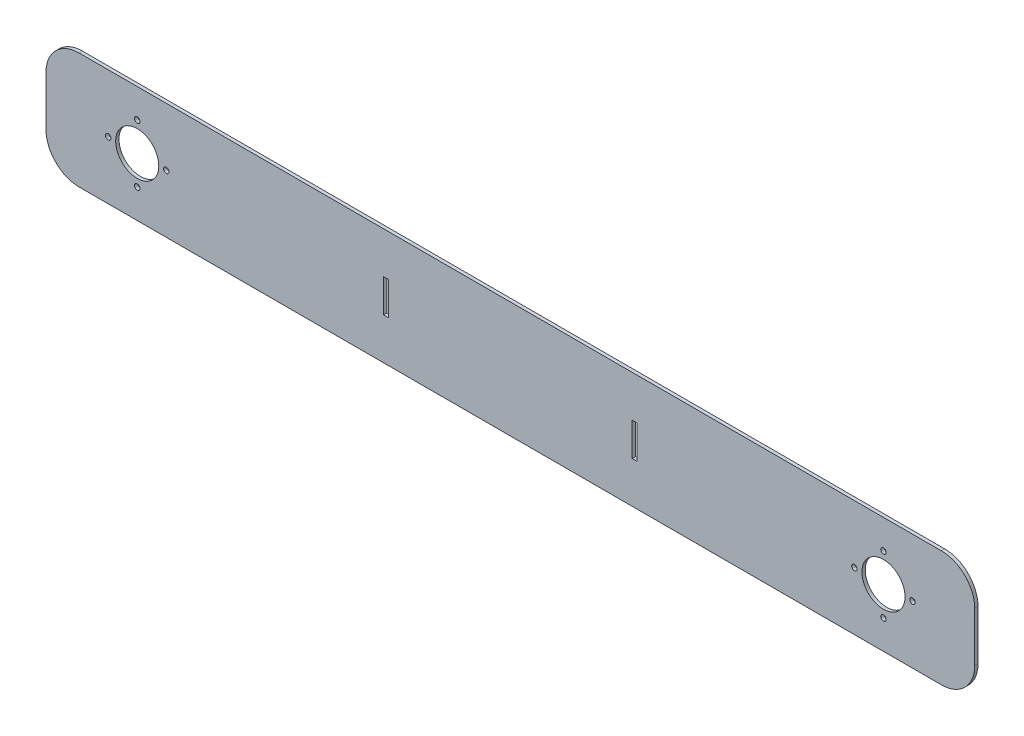
ISO-10303-21;
HEADER;
FILE_DESCRIPTION(('STEP AP214'),'2;1');
FILE_NAME('part.step','',(''),(''),'','','');
FILE_SCHEMA(('AUTOMOTIVE_DESIGN { 1 0 10303 214 1 1 1 1 }'));
ENDSEC;
DATA;
#1=APPLICATION_CONTEXT('core data for automotive mechanical design processes');
#2=APPLICATION_PROTOCOL_DEFINITION('international standard','automotive_design',2000,#1);
#3=PRODUCT_CONTEXT('',#1,'mechanical');
#4=PRODUCT('Part','Part','',(#3));
#5=PRODUCT_RELATED_PRODUCT_CATEGORY('part','',(#4));
#6=PRODUCT_DEFINITION_FORMATION('','',#4);
#7=PRODUCT_DEFINITION_CONTEXT('part definition',#1,'design');
#8=PRODUCT_DEFINITION('design','',#6,#7);
#9=PRODUCT_DEFINITION_SHAPE('','',#8);
#10=(LENGTH_UNIT() NAMED_UNIT(*) SI_UNIT(.MILLI.,.METRE.));
#11=(NAMED_UNIT(*) PLANE_ANGLE_UNIT() SI_UNIT($,.RADIAN.));
#12=(NAMED_UNIT(*) SI_UNIT($,.STERADIAN.) SOLID_ANGLE_UNIT());
#13=UNCERTAINTY_MEASURE_WITH_UNIT(LENGTH_MEASURE(1.E-05),#10,'distance_accuracy_value','');
#14=(GEOMETRIC_REPRESENTATION_CONTEXT(3) GLOBAL_UNCERTAINTY_ASSIGNED_CONTEXT((#13)) GLOBAL_UNIT_ASSIGNED_CONTEXT((#10,
#11,#12)) REPRESENTATION_CONTEXT('',''));
#15=CARTESIAN_POINT('',(0.,0.,0.));
#16=DIRECTION('',(0.,0.,1.));
#17=DIRECTION('',(1.,0.,0.));
#18=AXIS2_PLACEMENT_3D('',#15,#16,#17);
#19=CARTESIAN_POINT('',(-280.,-30.,2.));
#20=DIRECTION('',(0.,0.,1.));
#21=DIRECTION('',(1.,0.,0.));
#22=AXIS2_PLACEMENT_3D('',#19,#20,#21);
#23=PLANE('',#22);
#24=DIRECTION('',(0.,1.,0.));
#25=VECTOR('',#24,1.);
#26=CARTESIAN_POINT('',(76.4999999999999,10.,2.));
#27=LINE('',#26,#25);
#28=CARTESIAN_POINT('',(76.4999999999999,-10.,2.));
#29=VERTEX_POINT('',#28);
#30=CARTESIAN_POINT('',(76.5,10.,2.));
#31=VERTEX_POINT('',#30);
#32=EDGE_CURVE('E73',#29,#31,#27,.T.);
#33=ORIENTED_EDGE('',*,*,#32,.F.);
#34=DIRECTION('',(1.,0.,0.));
#35=VECTOR('',#34,1.);
#36=CARTESIAN_POINT('',(73.4999999999999,-10.,2.));
#37=LINE('',#36,#35);
#38=CARTESIAN_POINT('',(73.4999999999999,-10.,2.));
#39=VERTEX_POINT('',#38);
#40=EDGE_CURVE('E189',#39,#29,#37,.T.);
#41=ORIENTED_EDGE('',*,*,#40,.F.);
#42=DIRECTION('',(0.,-1.,0.));
#43=VECTOR('',#42,1.);
#44=CARTESIAN_POINT('',(73.4999999999999,10.,2.));
#45=LINE('',#44,#43);
#46=CARTESIAN_POINT('',(73.4999999999999,10.,2.));
#47=VERTEX_POINT('',#46);
#48=EDGE_CURVE('E174',#47,#39,#45,.T.);
#49=ORIENTED_EDGE('',*,*,#48,.F.);
#50=DIRECTION('',(-1.,0.,0.));
#51=VECTOR('',#50,1.);
#52=CARTESIAN_POINT('',(73.4999999999999,10.,2.));
#53=LINE('',#52,#51);
#54=EDGE_CURVE('E183',#31,#47,#53,.T.);
#55=ORIENTED_EDGE('',*,*,#54,.F.);
#56=EDGE_LOOP('',(#33,#41,#49,#55));
#57=FACE_BOUND('',#56,.T.);
#58=DIRECTION('',(0.,1.,0.));
#59=VECTOR('',#58,1.);
#60=CARTESIAN_POINT('',(-73.5000000000001,10.,2.));
#61=LINE('',#60,#59);
#62=CARTESIAN_POINT('',(-73.5000000000001,-10.,2.));
#63=VERTEX_POINT('',#62);
#64=CARTESIAN_POINT('',(-73.5000000000001,10.,2.));
#65=VERTEX_POINT('',#64);
#66=EDGE_CURVE('E196',#63,#65,#61,.T.);
#67=ORIENTED_EDGE('',*,*,#66,.F.);
#68=DIRECTION('',(1.,0.,0.));
#69=VECTOR('',#68,1.);
#70=CARTESIAN_POINT('',(-76.5000000000001,-10.,2.));
#71=LINE('',#70,#69);
#72=CARTESIAN_POINT('',(-76.5000000000001,-10.,2.));
#73=VERTEX_POINT('',#72);
#74=EDGE_CURVE('E206',#73,#63,#71,.T.);
#75=ORIENTED_EDGE('',*,*,#74,.F.);
#76=DIRECTION('',(0.,-1.,0.));
#77=VECTOR('',#76,1.);
#78=CARTESIAN_POINT('',(-76.5000000000001,10.,2.));
#79=LINE('',#78,#77);
#80=CARTESIAN_POINT('',(-76.5000000000001,10.,2.));
#81=VERTEX_POINT('',#80);
#82=EDGE_CURVE('E203',#81,#73,#79,.T.);
#83=ORIENTED_EDGE('',*,*,#82,.F.);
#84=DIRECTION('',(-1.,0.,0.));
#85=VECTOR('',#84,1.);
#86=CARTESIAN_POINT('',(-76.5000000000001,10.,2.));
#87=LINE('',#86,#85);
#88=EDGE_CURVE('E200',#65,#81,#87,.T.);
#89=ORIENTED_EDGE('',*,*,#88,.F.);
#90=EDGE_LOOP('',(#67,#75,#83,#89));
#91=FACE_BOUND('',#90,.T.);
#92=DIRECTION('',(1.,0.,0.));
#93=VECTOR('',#92,1.);
#94=CARTESIAN_POINT('',(-386.946895635758,-35.,2.));
#95=LINE('',#94,#93);
#96=CARTESIAN_POINT('',(-260.,-35.,2.));
#97=VERTEX_POINT('',#96);
#98=CARTESIAN_POINT('',(260.,-35.,2.));
#99=VERTEX_POINT('',#98);
#100=EDGE_CURVE('E230',#97,#99,#95,.T.);
#101=ORIENTED_EDGE('',*,*,#100,.T.);
#102=CARTESIAN_POINT('',(260.,-15.,2.));
#103=DIRECTION('',(0.,0.,1.));
#104=DIRECTION('',(1.,0.,0.));
#105=AXIS2_PLACEMENT_3D('',#102,#103,#104);
#106=CIRCLE('',#105,20.);
#107=CARTESIAN_POINT('',(280.,-15.,2.));
#108=VERTEX_POINT('',#107);
#109=EDGE_CURVE('E325',#99,#108,#106,.T.);
#110=ORIENTED_EDGE('',*,*,#109,.T.);
#111=DIRECTION('',(0.,-1.,0.));
#112=VECTOR('',#111,1.);
#113=CARTESIAN_POINT('',(280.,58.1576556097638,2.));
#114=LINE('',#113,#112);
#115=CARTESIAN_POINT('',(280.,15.,2.));
#116=VERTEX_POINT('',#115);
#117=EDGE_CURVE('E212',#116,#108,#114,.T.);
#118=ORIENTED_EDGE('',*,*,#117,.F.);
#119=CARTESIAN_POINT('',(260.,15.,2.));
#120=DIRECTION('',(0.,0.,1.));
#121=DIRECTION('',(1.,0.,0.));
#122=AXIS2_PLACEMENT_3D('',#119,#120,#121);
#123=CIRCLE('',#122,20.);
#124=CARTESIAN_POINT('',(260.,35.,2.));
#125=VERTEX_POINT('',#124);
#126=EDGE_CURVE('E323',#116,#125,#123,.T.);
#127=ORIENTED_EDGE('',*,*,#126,.T.);
#128=DIRECTION('',(1.,0.,0.));
#129=VECTOR('',#128,1.);
#130=CARTESIAN_POINT('',(-386.946895635758,35.,2.));
#131=LINE('',#130,#129);
#132=CARTESIAN_POINT('',(-260.,35.,2.));
#133=VERTEX_POINT('',#132);
#134=EDGE_CURVE('E233',#133,#125,#131,.T.);
#135=ORIENTED_EDGE('',*,*,#134,.F.);
#136=CARTESIAN_POINT('',(-260.,15.,2.));
#137=DIRECTION('',(0.,0.,1.));
#138=DIRECTION('',(1.,0.,0.));
#139=AXIS2_PLACEMENT_3D('',#136,#137,#138);
#140=CIRCLE('',#139,20.);
#141=CARTESIAN_POINT('',(-280.,15.,2.));
#142=VERTEX_POINT('',#141);
#143=EDGE_CURVE('E319',#133,#142,#140,.T.);
#144=ORIENTED_EDGE('',*,*,#143,.T.);
#145=DIRECTION('',(0.,1.,0.));
#146=VECTOR('',#145,1.);
#147=CARTESIAN_POINT('',(-280.,62.6260788166557,2.));
#148=LINE('',#147,#146);
#149=CARTESIAN_POINT('',(-280.,-15.,2.));
#150=VERTEX_POINT('',#149);
#151=EDGE_CURVE('E224',#150,#142,#148,.T.);
#152=ORIENTED_EDGE('',*,*,#151,.F.);
#153=CARTESIAN_POINT('',(-260.,-15.,2.));
#154=DIRECTION('',(0.,0.,1.));
#155=DIRECTION('',(1.,0.,0.));
#156=AXIS2_PLACEMENT_3D('',#153,#154,#155);
#157=CIRCLE('',#156,20.);
#158=EDGE_CURVE('E321',#150,#97,#157,.T.);
#159=ORIENTED_EDGE('',*,*,#158,.T.);
#160=EDGE_LOOP('',(#101,#110,#118,#127,#135,#144,#152,#159));
#161=FACE_BOUND('',#160,.T.);
#162=CARTESIAN_POINT('',(-225.,-17.5,2.));
#163=DIRECTION('',(0.,0.,1.));
#164=DIRECTION('',(1.,0.,0.));
#165=AXIS2_PLACEMENT_3D('',#162,#163,#164);
#166=CIRCLE('',#165,1.65000000000002);
#167=CARTESIAN_POINT('',(-223.35,-17.5,2.));
#168=VERTEX_POINT('',#167);
#169=EDGE_CURVE('E255',#168,#168,#166,.T.);
#170=ORIENTED_EDGE('',*,*,#169,.F.);
#171=EDGE_LOOP('',(#170));
#172=FACE_BOUND('',#171,.T.);
#173=CARTESIAN_POINT('',(242.5,0.,2.));
#174=DIRECTION('',(0.,0.,1.));
#175=DIRECTION('',(1.,0.,0.));
#176=AXIS2_PLACEMENT_3D('',#173,#174,#175);
#177=CIRCLE('',#176,1.65000000000002);
#178=CARTESIAN_POINT('',(244.15,0.,2.));
#179=VERTEX_POINT('',#178);
#180=EDGE_CURVE('E244',#179,#179,#177,.T.);
#181=ORIENTED_EDGE('',*,*,#180,.F.);
#182=EDGE_LOOP('',(#181));
#183=FACE_BOUND('',#182,.T.);
#184=CARTESIAN_POINT('',(225.,17.5,2.));
#185=DIRECTION('',(0.,0.,1.));
#186=DIRECTION('',(1.,0.,0.));
#187=AXIS2_PLACEMENT_3D('',#184,#185,#186);
#188=CIRCLE('',#187,1.65000000000002);
#189=CARTESIAN_POINT('',(226.65,17.5,2.));
#190=VERTEX_POINT('',#189);
#191=EDGE_CURVE('E237',#190,#190,#188,.T.);
#192=ORIENTED_EDGE('',*,*,#191,.F.);
#193=EDGE_LOOP('',(#192));
#194=FACE_BOUND('',#193,.T.);
#195=CARTESIAN_POINT('',(207.5,0.,2.));
#196=DIRECTION('',(0.,0.,1.));
#197=DIRECTION('',(1.,0.,0.));
#198=AXIS2_PLACEMENT_3D('',#195,#196,#197);
#199=CIRCLE('',#198,1.65000000000002);
#200=CARTESIAN_POINT('',(209.15,0.,2.));
#201=VERTEX_POINT('',#200);
#202=EDGE_CURVE('E245',#201,#201,#199,.T.);
#203=ORIENTED_EDGE('',*,*,#202,.F.);
#204=EDGE_LOOP('',(#203));
#205=FACE_BOUND('',#204,.T.);
#206=CARTESIAN_POINT('',(225.,-17.5,2.));
#207=DIRECTION('',(0.,0.,1.));
#208=DIRECTION('',(1.,0.,0.));
#209=AXIS2_PLACEMENT_3D('',#206,#207,#208);
#210=CIRCLE('',#209,1.65000000000002);
#211=CARTESIAN_POINT('',(226.65,-17.5,2.));
#212=VERTEX_POINT('',#211);
#213=EDGE_CURVE('E236',#212,#212,#210,.T.);
#214=ORIENTED_EDGE('',*,*,#213,.F.);
#215=EDGE_LOOP('',(#214));
#216=FACE_BOUND('',#215,.T.);
#217=CARTESIAN_POINT('',(225.,0.,2.));
#218=DIRECTION('',(0.,0.,1.));
#219=DIRECTION('',(1.,0.,0.));
#220=AXIS2_PLACEMENT_3D('',#217,#218,#219);
#221=CIRCLE('',#220,13.);
#222=CARTESIAN_POINT('',(238.,0.,2.));
#223=VERTEX_POINT('',#222);
#224=EDGE_CURVE('E279',#223,#223,#221,.T.);
#225=ORIENTED_EDGE('',*,*,#224,.F.);
#226=EDGE_LOOP('',(#225));
#227=FACE_BOUND('',#226,.T.);
#228=CARTESIAN_POINT('',(-242.5,0.,2.));
#229=DIRECTION('',(0.,0.,1.));
#230=DIRECTION('',(1.,0.,0.));
#231=AXIS2_PLACEMENT_3D('',#228,#229,#230);
#232=CIRCLE('',#231,1.65000000000002);
#233=CARTESIAN_POINT('',(-240.85,0.,2.));
#234=VERTEX_POINT('',#233);
#235=EDGE_CURVE('E274',#234,#234,#232,.T.);
#236=ORIENTED_EDGE('',*,*,#235,.F.);
#237=EDGE_LOOP('',(#236));
#238=FACE_BOUND('',#237,.T.);
#239=CARTESIAN_POINT('',(-207.5,0.,2.));
#240=DIRECTION('',(0.,0.,1.));
#241=DIRECTION('',(1.,0.,0.));
#242=AXIS2_PLACEMENT_3D('',#239,#240,#241);
#243=CIRCLE('',#242,1.65000000000002);
#244=CARTESIAN_POINT('',(-205.85,0.,2.));
#245=VERTEX_POINT('',#244);
#246=EDGE_CURVE('E267',#245,#245,#243,.T.);
#247=ORIENTED_EDGE('',*,*,#246,.F.);
#248=EDGE_LOOP('',(#247));
#249=FACE_BOUND('',#248,.T.);
#250=CARTESIAN_POINT('',(-225.,17.5,2.));
#251=DIRECTION('',(0.,0.,1.));
#252=DIRECTION('',(1.,0.,0.));
#253=AXIS2_PLACEMENT_3D('',#250,#251,#252);
#254=CIRCLE('',#253,1.65000000000002);
#255=CARTESIAN_POINT('',(-223.35,17.5,2.));
#256=VERTEX_POINT('',#255);
#257=EDGE_CURVE('E262',#256,#256,#254,.T.);
#258=ORIENTED_EDGE('',*,*,#257,.F.);
#259=EDGE_LOOP('',(#258));
#260=FACE_BOUND('',#259,.T.);
#261=CARTESIAN_POINT('',(-225.,0.,2.));
#262=DIRECTION('',(0.,0.,1.));
#263=DIRECTION('',(1.,0.,0.));
#264=AXIS2_PLACEMENT_3D('',#261,#262,#263);
#265=CIRCLE('',#264,13.);
#266=CARTESIAN_POINT('',(-212.,0.,2.));
#267=VERTEX_POINT('',#266);
#268=EDGE_CURVE('E286',#267,#267,#265,.T.);
#269=ORIENTED_EDGE('',*,*,#268,.F.);
#270=EDGE_LOOP('',(#269));
#271=FACE_BOUND('',#270,.T.);
#272=ADVANCED_FACE('F58',(#57,#91,#161,#172,#183,#194,#205,#216,#227,#238,#249,#260,#271),#23,.T.);
#273=CARTESIAN_POINT('',(-280.,-30.,0.));
#274=DIRECTION('',(0.,0.,1.));
#275=DIRECTION('',(1.,0.,0.));
#276=AXIS2_PLACEMENT_3D('',#273,#274,#275);
#277=PLANE('',#276);
#278=DIRECTION('',(1.,0.,0.));
#279=VECTOR('',#278,1.);
#280=CARTESIAN_POINT('',(-280.,-10.,0.));
#281=LINE('',#280,#279);
#282=CARTESIAN_POINT('',(73.4999999999999,-10.,0.));
#283=VERTEX_POINT('',#282);
#284=CARTESIAN_POINT('',(76.4999999999999,-10.,0.));
#285=VERTEX_POINT('',#284);
#286=EDGE_CURVE('E66',#283,#285,#281,.T.);
#287=ORIENTED_EDGE('',*,*,#286,.T.);
#288=DIRECTION('',(0.,1.,0.));
#289=VECTOR('',#288,1.);
#290=CARTESIAN_POINT('',(76.5,-30.,0.));
#291=LINE('',#290,#289);
#292=CARTESIAN_POINT('',(76.4999999999999,10.,0.));
#293=VERTEX_POINT('',#292);
#294=EDGE_CURVE('E13',#285,#293,#291,.T.);
#295=ORIENTED_EDGE('',*,*,#294,.T.);
#296=DIRECTION('',(-1.,0.,0.));
#297=VECTOR('',#296,1.);
#298=CARTESIAN_POINT('',(-280.,10.,0.));
#299=LINE('',#298,#297);
#300=CARTESIAN_POINT('',(73.4999999999999,10.,0.));
#301=VERTEX_POINT('',#300);
#302=EDGE_CURVE('E350',#293,#301,#299,.T.);
#303=ORIENTED_EDGE('',*,*,#302,.T.);
#304=DIRECTION('',(0.,-1.,0.));
#305=VECTOR('',#304,1.);
#306=CARTESIAN_POINT('',(73.5,-30.,0.));
#307=LINE('',#306,#305);
#308=EDGE_CURVE('E177',#301,#283,#307,.T.);
#309=ORIENTED_EDGE('',*,*,#308,.T.);
#310=EDGE_LOOP('',(#287,#295,#303,#309));
#311=FACE_BOUND('',#310,.T.);
#312=DIRECTION('',(1.,0.,0.));
#313=VECTOR('',#312,1.);
#314=CARTESIAN_POINT('',(-280.,-10.,0.));
#315=LINE('',#314,#313);
#316=CARTESIAN_POINT('',(-76.5000000000001,-10.,0.));
#317=VERTEX_POINT('',#316);
#318=CARTESIAN_POINT('',(-73.5000000000001,-10.,0.));
#319=VERTEX_POINT('',#318);
#320=EDGE_CURVE('E344',#317,#319,#315,.T.);
#321=ORIENTED_EDGE('',*,*,#320,.T.);
#322=DIRECTION('',(0.,1.,0.));
#323=VECTOR('',#322,1.);
#324=CARTESIAN_POINT('',(-73.5000000000001,-30.,0.));
#325=LINE('',#324,#323);
#326=CARTESIAN_POINT('',(-73.5000000000001,10.,0.));
#327=VERTEX_POINT('',#326);
#328=EDGE_CURVE('E347',#319,#327,#325,.T.);
#329=ORIENTED_EDGE('',*,*,#328,.T.);
#330=DIRECTION('',(-1.,0.,0.));
#331=VECTOR('',#330,1.);
#332=CARTESIAN_POINT('',(-280.,10.,0.));
#333=LINE('',#332,#331);
#334=CARTESIAN_POINT('',(-76.5000000000001,10.,0.));
#335=VERTEX_POINT('',#334);
#336=EDGE_CURVE('E338',#327,#335,#333,.T.);
#337=ORIENTED_EDGE('',*,*,#336,.T.);
#338=DIRECTION('',(0.,-1.,0.));
#339=VECTOR('',#338,1.);
#340=CARTESIAN_POINT('',(-76.5000000000001,-30.,0.));
#341=LINE('',#340,#339);
#342=EDGE_CURVE('E341',#335,#317,#341,.T.);
#343=ORIENTED_EDGE('',*,*,#342,.T.);
#344=EDGE_LOOP('',(#321,#329,#337,#343));
#345=FACE_BOUND('',#344,.T.);
#346=CARTESIAN_POINT('',(-225.,0.,0.));
#347=DIRECTION('',(0.,0.,1.));
#348=DIRECTION('',(1.,0.,0.));
#349=AXIS2_PLACEMENT_3D('',#346,#347,#348);
#350=CIRCLE('',#349,13.);
#351=CARTESIAN_POINT('',(-212.,0.,0.));
#352=VERTEX_POINT('',#351);
#353=EDGE_CURVE('E293',#352,#352,#350,.F.);
#354=ORIENTED_EDGE('',*,*,#353,.F.);
#355=EDGE_LOOP('',(#354));
#356=FACE_BOUND('',#355,.T.);
#357=CARTESIAN_POINT('',(-225.,17.5,0.));
#358=DIRECTION('',(0.,0.,1.));
#359=DIRECTION('',(1.,0.,0.));
#360=AXIS2_PLACEMENT_3D('',#357,#358,#359);
#361=CIRCLE('',#360,1.65000000000002);
#362=CARTESIAN_POINT('',(-223.35,17.5,0.));
#363=VERTEX_POINT('',#362);
#364=EDGE_CURVE('E271',#363,#363,#361,.F.);
#365=ORIENTED_EDGE('',*,*,#364,.F.);
#366=EDGE_LOOP('',(#365));
#367=FACE_BOUND('',#366,.T.);
#368=CARTESIAN_POINT('',(-207.5,0.,0.));
#369=DIRECTION('',(0.,0.,1.));
#370=DIRECTION('',(1.,0.,0.));
#371=AXIS2_PLACEMENT_3D('',#368,#369,#370);
#372=CIRCLE('',#371,1.65000000000002);
#373=CARTESIAN_POINT('',(-205.85,0.,0.));
#374=VERTEX_POINT('',#373);
#375=EDGE_CURVE('E270',#374,#374,#372,.F.);
#376=ORIENTED_EDGE('',*,*,#375,.F.);
#377=EDGE_LOOP('',(#376));
#378=FACE_BOUND('',#377,.T.);
#379=CARTESIAN_POINT('',(-242.5,0.,0.));
#380=DIRECTION('',(0.,0.,1.));
#381=DIRECTION('',(1.,0.,0.));
#382=AXIS2_PLACEMENT_3D('',#379,#380,#381);
#383=CIRCLE('',#382,1.65000000000002);
#384=CARTESIAN_POINT('',(-240.85,0.,0.));
#385=VERTEX_POINT('',#384);
#386=EDGE_CURVE('E283',#385,#385,#383,.F.);
#387=ORIENTED_EDGE('',*,*,#386,.F.);
#388=EDGE_LOOP('',(#387));
#389=FACE_BOUND('',#388,.T.);
#390=CARTESIAN_POINT('',(225.,0.,0.));
#391=DIRECTION('',(0.,0.,1.));
#392=DIRECTION('',(1.,0.,0.));
#393=AXIS2_PLACEMENT_3D('',#390,#391,#392);
#394=CIRCLE('',#393,13.);
#395=CARTESIAN_POINT('',(238.,0.,0.));
#396=VERTEX_POINT('',#395);
#397=EDGE_CURVE('E282',#396,#396,#394,.F.);
#398=ORIENTED_EDGE('',*,*,#397,.F.);
#399=EDGE_LOOP('',(#398));
#400=FACE_BOUND('',#399,.T.);
#401=CARTESIAN_POINT('',(225.,-17.5,0.));
#402=DIRECTION('',(0.,0.,1.));
#403=DIRECTION('',(1.,0.,0.));
#404=AXIS2_PLACEMENT_3D('',#401,#402,#403);
#405=CIRCLE('',#404,1.65000000000002);
#406=CARTESIAN_POINT('',(226.65,-17.5,0.));
#407=VERTEX_POINT('',#406);
#408=EDGE_CURVE('E248',#407,#407,#405,.F.);
#409=ORIENTED_EDGE('',*,*,#408,.F.);
#410=EDGE_LOOP('',(#409));
#411=FACE_BOUND('',#410,.T.);
#412=CARTESIAN_POINT('',(207.5,0.,0.));
#413=DIRECTION('',(0.,0.,1.));
#414=DIRECTION('',(1.,0.,0.));
#415=AXIS2_PLACEMENT_3D('',#412,#413,#414);
#416=CIRCLE('',#415,1.65000000000002);
#417=CARTESIAN_POINT('',(209.15,0.,0.));
#418=VERTEX_POINT('',#417);
#419=EDGE_CURVE('E241',#418,#418,#416,.F.);
#420=ORIENTED_EDGE('',*,*,#419,.F.);
#421=EDGE_LOOP('',(#420));
#422=FACE_BOUND('',#421,.T.);
#423=CARTESIAN_POINT('',(225.,17.5,0.));
#424=DIRECTION('',(0.,0.,1.));
#425=DIRECTION('',(1.,0.,0.));
#426=AXIS2_PLACEMENT_3D('',#423,#424,#425);
#427=CIRCLE('',#426,1.65000000000002);
#428=CARTESIAN_POINT('',(226.65,17.5,0.));
#429=VERTEX_POINT('',#428);
#430=EDGE_CURVE('E240',#429,#429,#427,.F.);
#431=ORIENTED_EDGE('',*,*,#430,.F.);
#432=EDGE_LOOP('',(#431));
#433=FACE_BOUND('',#432,.T.);
#434=CARTESIAN_POINT('',(242.5,0.,0.));
#435=DIRECTION('',(0.,0.,1.));
#436=DIRECTION('',(1.,0.,0.));
#437=AXIS2_PLACEMENT_3D('',#434,#435,#436);
#438=CIRCLE('',#437,1.65000000000002);
#439=CARTESIAN_POINT('',(244.15,0.,0.));
#440=VERTEX_POINT('',#439);
#441=EDGE_CURVE('E259',#440,#440,#438,.F.);
#442=ORIENTED_EDGE('',*,*,#441,.F.);
#443=EDGE_LOOP('',(#442));
#444=FACE_BOUND('',#443,.T.);
#445=CARTESIAN_POINT('',(-225.,-17.5,0.));
#446=DIRECTION('',(0.,0.,1.));
#447=DIRECTION('',(1.,0.,0.));
#448=AXIS2_PLACEMENT_3D('',#445,#446,#447);
#449=CIRCLE('',#448,1.65000000000002);
#450=CARTESIAN_POINT('',(-223.35,-17.5,0.));
#451=VERTEX_POINT('',#450);
#452=EDGE_CURVE('E258',#451,#451,#449,.F.);
#453=ORIENTED_EDGE('',*,*,#452,.F.);
#454=EDGE_LOOP('',(#453));
#455=FACE_BOUND('',#454,.T.);
#456=DIRECTION('',(0.,-1.,0.));
#457=VECTOR('',#456,1.);
#458=CARTESIAN_POINT('',(280.,-30.,0.));
#459=LINE('',#458,#457);
#460=CARTESIAN_POINT('',(280.,15.,0.));
#461=VERTEX_POINT('',#460);
#462=CARTESIAN_POINT('',(280.,-15.,0.));
#463=VERTEX_POINT('',#462);
#464=EDGE_CURVE('E221',#461,#463,#459,.T.);
#465=ORIENTED_EDGE('',*,*,#464,.T.);
#466=CARTESIAN_POINT('',(260.,-15.,0.));
#467=DIRECTION('',(0.,0.,1.));
#468=DIRECTION('',(1.,0.,0.));
#469=AXIS2_PLACEMENT_3D('',#466,#467,#468);
#470=CIRCLE('',#469,20.);
#471=CARTESIAN_POINT('',(260.,-35.,0.));
#472=VERTEX_POINT('',#471);
#473=EDGE_CURVE('E313',#463,#472,#470,.F.);
#474=ORIENTED_EDGE('',*,*,#473,.T.);
#475=DIRECTION('',(1.,0.,0.));
#476=VECTOR('',#475,1.);
#477=CARTESIAN_POINT('',(-280.,-35.,0.));
#478=LINE('',#477,#476);
#479=CARTESIAN_POINT('',(-260.,-35.,0.));
#480=VERTEX_POINT('',#479);
#481=EDGE_CURVE('E296',#480,#472,#478,.T.);
#482=ORIENTED_EDGE('',*,*,#481,.F.);
#483=CARTESIAN_POINT('',(-260.,-15.,0.));
#484=DIRECTION('',(0.,0.,1.));
#485=DIRECTION('',(1.,0.,0.));
#486=AXIS2_PLACEMENT_3D('',#483,#484,#485);
#487=CIRCLE('',#486,20.);
#488=CARTESIAN_POINT('',(-280.,-15.,0.));
#489=VERTEX_POINT('',#488);
#490=EDGE_CURVE('E309',#480,#489,#487,.F.);
#491=ORIENTED_EDGE('',*,*,#490,.T.);
#492=DIRECTION('',(0.,1.,0.));
#493=VECTOR('',#492,1.);
#494=CARTESIAN_POINT('',(-280.,-30.,0.));
#495=LINE('',#494,#493);
#496=CARTESIAN_POINT('',(-280.,15.,0.));
#497=VERTEX_POINT('',#496);
#498=EDGE_CURVE('E227',#489,#497,#495,.T.);
#499=ORIENTED_EDGE('',*,*,#498,.T.);
#500=CARTESIAN_POINT('',(-260.,15.,0.));
#501=DIRECTION('',(0.,0.,1.));
#502=DIRECTION('',(1.,0.,0.));
#503=AXIS2_PLACEMENT_3D('',#500,#501,#502);
#504=CIRCLE('',#503,20.);
#505=CARTESIAN_POINT('',(-260.,35.,0.));
#506=VERTEX_POINT('',#505);
#507=EDGE_CURVE('E307',#497,#506,#504,.F.);
#508=ORIENTED_EDGE('',*,*,#507,.T.);
#509=DIRECTION('',(1.,0.,0.));
#510=VECTOR('',#509,1.);
#511=CARTESIAN_POINT('',(-280.,35.,0.));
#512=LINE('',#511,#510);
#513=CARTESIAN_POINT('',(260.,35.,0.));
#514=VERTEX_POINT('',#513);
#515=EDGE_CURVE('E299',#506,#514,#512,.T.);
#516=ORIENTED_EDGE('',*,*,#515,.T.);
#517=CARTESIAN_POINT('',(260.,15.,0.));
#518=DIRECTION('',(0.,0.,1.));
#519=DIRECTION('',(1.,0.,0.));
#520=AXIS2_PLACEMENT_3D('',#517,#518,#519);
#521=CIRCLE('',#520,20.);
#522=EDGE_CURVE('E311',#514,#461,#521,.F.);
#523=ORIENTED_EDGE('',*,*,#522,.T.);
#524=EDGE_LOOP('',(#465,#474,#482,#491,#499,#508,#516,#523));
#525=FACE_BOUND('',#524,.T.);
#526=ADVANCED_FACE('F354',(#311,#345,#356,#367,#378,#389,#400,#411,#422,#433,#444,#455,#525),
#277,.F.);
#527=CARTESIAN_POINT('',(-225.,0.,-0.00100000000000013));
#528=DIRECTION('',(0.,0.,1.));
#529=DIRECTION('',(1.,0.,0.));
#530=AXIS2_PLACEMENT_3D('',#527,#528,#529);
#531=CYLINDRICAL_SURFACE('',#530,13.);
#532=ORIENTED_EDGE('',*,*,#268,.T.);
#533=EDGE_LOOP('',(#532));
#534=FACE_BOUND('',#533,.T.);
#535=ORIENTED_EDGE('',*,*,#353,.T.);
#536=EDGE_LOOP('',(#535));
#537=FACE_BOUND('',#536,.T.);
#538=ADVANCED_FACE('F378',(#534,#537),#531,.F.);
#539=CARTESIAN_POINT('',(-225.,17.5,-0.00100000000000013));
#540=DIRECTION('',(0.,0.,1.));
#541=DIRECTION('',(1.,0.,0.));
#542=AXIS2_PLACEMENT_3D('',#539,#540,#541);
#543=CYLINDRICAL_SURFACE('',#542,1.65000000000002);
#544=ORIENTED_EDGE('',*,*,#257,.T.);
#545=EDGE_LOOP('',(#544));
#546=FACE_BOUND('',#545,.T.);
#547=ORIENTED_EDGE('',*,*,#364,.T.);
#548=EDGE_LOOP('',(#547));
#549=FACE_BOUND('',#548,.T.);
#550=ADVANCED_FACE('F451',(#546,#549),#543,.F.);
#551=CARTESIAN_POINT('',(-207.5,0.,-0.00100000000000013));
#552=DIRECTION('',(0.,0.,1.));
#553=DIRECTION('',(1.,0.,0.));
#554=AXIS2_PLACEMENT_3D('',#551,#552,#553);
#555=CYLINDRICAL_SURFACE('',#554,1.65000000000002);
#556=ORIENTED_EDGE('',*,*,#246,.T.);
#557=EDGE_LOOP('',(#556));
#558=FACE_BOUND('',#557,.T.);
#559=ORIENTED_EDGE('',*,*,#375,.T.);
#560=EDGE_LOOP('',(#559));
#561=FACE_BOUND('',#560,.T.);
#562=ADVANCED_FACE('F490',(#558,#561),#555,.F.);
#563=CARTESIAN_POINT('',(-242.5,0.,-0.00100000000000013));
#564=DIRECTION('',(0.,0.,1.));
#565=DIRECTION('',(1.,0.,0.));
#566=AXIS2_PLACEMENT_3D('',#563,#564,#565);
#567=CYLINDRICAL_SURFACE('',#566,1.65000000000002);
#568=ORIENTED_EDGE('',*,*,#235,.T.);
#569=EDGE_LOOP('',(#568));
#570=FACE_BOUND('',#569,.T.);
#571=ORIENTED_EDGE('',*,*,#386,.T.);
#572=EDGE_LOOP('',(#571));
#573=FACE_BOUND('',#572,.T.);
#574=ADVANCED_FACE('F493',(#570,#573),#567,.F.);
#575=CARTESIAN_POINT('',(225.,0.,-0.00100000000000013));
#576=DIRECTION('',(0.,0.,1.));
#577=DIRECTION('',(1.,0.,0.));
#578=AXIS2_PLACEMENT_3D('',#575,#576,#577);
#579=CYLINDRICAL_SURFACE('',#578,13.);
#580=ORIENTED_EDGE('',*,*,#224,.T.);
#581=EDGE_LOOP('',(#580));
#582=FACE_BOUND('',#581,.T.);
#583=ORIENTED_EDGE('',*,*,#397,.T.);
#584=EDGE_LOOP('',(#583));
#585=FACE_BOUND('',#584,.T.);
#586=ADVANCED_FACE('F498',(#582,#585),#579,.F.);
#587=CARTESIAN_POINT('',(225.,-17.5,-0.00100000000000013));
#588=DIRECTION('',(0.,0.,1.));
#589=DIRECTION('',(1.,0.,0.));
#590=AXIS2_PLACEMENT_3D('',#587,#588,#589);
#591=CYLINDRICAL_SURFACE('',#590,1.65000000000002);
#592=ORIENTED_EDGE('',*,*,#213,.T.);
#593=EDGE_LOOP('',(#592));
#594=FACE_BOUND('',#593,.T.);
#595=ORIENTED_EDGE('',*,*,#408,.T.);
#596=EDGE_LOOP('',(#595));
#597=FACE_BOUND('',#596,.T.);
#598=ADVANCED_FACE('F487',(#594,#597),#591,.F.);
#599=CARTESIAN_POINT('',(207.5,0.,-0.00100000000000013));
#600=DIRECTION('',(0.,0.,1.));
#601=DIRECTION('',(1.,0.,0.));
#602=AXIS2_PLACEMENT_3D('',#599,#600,#601);
#603=CYLINDRICAL_SURFACE('',#602,1.65000000000002);
#604=ORIENTED_EDGE('',*,*,#202,.T.);
#605=EDGE_LOOP('',(#604));
#606=FACE_BOUND('',#605,.T.);
#607=ORIENTED_EDGE('',*,*,#419,.T.);
#608=EDGE_LOOP('',(#607));
#609=FACE_BOUND('',#608,.T.);
#610=ADVANCED_FACE('F518',(#606,#609),#603,.F.);
#611=CARTESIAN_POINT('',(225.,17.5,-0.00100000000000013));
#612=DIRECTION('',(0.,0.,1.));
#613=DIRECTION('',(1.,0.,0.));
#614=AXIS2_PLACEMENT_3D('',#611,#612,#613);
#615=CYLINDRICAL_SURFACE('',#614,1.65000000000002);
#616=ORIENTED_EDGE('',*,*,#191,.T.);
#617=EDGE_LOOP('',(#616));
#618=FACE_BOUND('',#617,.T.);
#619=ORIENTED_EDGE('',*,*,#430,.T.);
#620=EDGE_LOOP('',(#619));
#621=FACE_BOUND('',#620,.T.);
#622=ADVANCED_FACE('F483',(#618,#621),#615,.F.);
#623=CARTESIAN_POINT('',(242.5,0.,-0.00100000000000013));
#624=DIRECTION('',(0.,0.,1.));
#625=DIRECTION('',(1.,0.,0.));
#626=AXIS2_PLACEMENT_3D('',#623,#624,#625);
#627=CYLINDRICAL_SURFACE('',#626,1.65000000000002);
#628=ORIENTED_EDGE('',*,*,#180,.T.);
#629=EDGE_LOOP('',(#628));
#630=FACE_BOUND('',#629,.T.);
#631=ORIENTED_EDGE('',*,*,#441,.T.);
#632=EDGE_LOOP('',(#631));
#633=FACE_BOUND('',#632,.T.);
#634=ADVANCED_FACE('F475',(#630,#633),#627,.F.);
#635=CARTESIAN_POINT('',(-225.,-17.5,-0.00100000000000013));
#636=DIRECTION('',(0.,0.,1.));
#637=DIRECTION('',(1.,0.,0.));
#638=AXIS2_PLACEMENT_3D('',#635,#636,#637);
#639=CYLINDRICAL_SURFACE('',#638,1.65000000000002);
#640=ORIENTED_EDGE('',*,*,#169,.T.);
#641=EDGE_LOOP('',(#640));
#642=FACE_BOUND('',#641,.T.);
#643=ORIENTED_EDGE('',*,*,#452,.T.);
#644=EDGE_LOOP('',(#643));
#645=FACE_BOUND('',#644,.T.);
#646=ADVANCED_FACE('F473',(#642,#645),#639,.F.);
#647=CARTESIAN_POINT('',(-386.946895635758,-35.,-8.));
#648=DIRECTION('',(0.,-1.,0.));
#649=DIRECTION('',(0.,0.,-1.));
#650=AXIS2_PLACEMENT_3D('',#647,#648,#649);
#651=PLANE('',#650);
#652=ORIENTED_EDGE('',*,*,#481,.T.);
#653=DIRECTION('',(0.,0.,-1.));
#654=VECTOR('',#653,1.);
#655=CARTESIAN_POINT('',(260.,-35.,2.));
#656=LINE('',#655,#654);
#657=EDGE_CURVE('E317',#472,#99,#656,.F.);
#658=ORIENTED_EDGE('',*,*,#657,.T.);
#659=ORIENTED_EDGE('',*,*,#100,.F.);
#660=DIRECTION('',(0.,0.,1.));
#661=VECTOR('',#660,1.);
#662=CARTESIAN_POINT('',(-260.,-35.,0.));
#663=LINE('',#662,#661);
#664=EDGE_CURVE('E315',#97,#480,#663,.F.);
#665=ORIENTED_EDGE('',*,*,#664,.T.);
#666=EDGE_LOOP('',(#652,#658,#659,#665));
#667=FACE_BOUND('',#666,.T.);
#668=ADVANCED_FACE('F425',(#667),#651,.T.);
#669=CARTESIAN_POINT('',(-386.946895635758,35.,-8.));
#670=DIRECTION('',(0.,-1.,0.));
#671=DIRECTION('',(0.,0.,-1.));
#672=AXIS2_PLACEMENT_3D('',#669,#670,#671);
#673=PLANE('',#672);
#674=ORIENTED_EDGE('',*,*,#134,.T.);
#675=DIRECTION('',(0.,0.,-1.));
#676=VECTOR('',#675,1.);
#677=CARTESIAN_POINT('',(260.,35.,-8.));
#678=LINE('',#677,#676);
#679=EDGE_CURVE('E330',#125,#514,#678,.T.);
#680=ORIENTED_EDGE('',*,*,#679,.T.);
#681=ORIENTED_EDGE('',*,*,#515,.F.);
#682=DIRECTION('',(0.,0.,1.));
#683=VECTOR('',#682,1.);
#684=CARTESIAN_POINT('',(-260.,35.,-8.));
#685=LINE('',#684,#683);
#686=EDGE_CURVE('E327',#506,#133,#685,.T.);
#687=ORIENTED_EDGE('',*,*,#686,.T.);
#688=EDGE_LOOP('',(#674,#680,#681,#687));
#689=FACE_BOUND('',#688,.T.);
#690=ADVANCED_FACE('F413',(#689),#673,.F.);
#691=CARTESIAN_POINT('',(-280.,62.6260788166557,-8.));
#692=DIRECTION('',(1.,0.,0.));
#693=DIRECTION('',(0.,0.,-1.));
#694=AXIS2_PLACEMENT_3D('',#691,#692,#693);
#695=PLANE('',#694);
#696=ORIENTED_EDGE('',*,*,#498,.F.);
#697=DIRECTION('',(0.,0.,1.));
#698=VECTOR('',#697,1.);
#699=CARTESIAN_POINT('',(-280.,-15.,2.));
#700=LINE('',#699,#698);
#701=EDGE_CURVE('E335',#489,#150,#700,.T.);
#702=ORIENTED_EDGE('',*,*,#701,.T.);
#703=ORIENTED_EDGE('',*,*,#151,.T.);
#704=DIRECTION('',(0.,0.,1.));
#705=VECTOR('',#704,1.);
#706=CARTESIAN_POINT('',(-280.,15.,-8.));
#707=LINE('',#706,#705);
#708=EDGE_CURVE('E333',#142,#497,#707,.F.);
#709=ORIENTED_EDGE('',*,*,#708,.T.);
#710=EDGE_LOOP('',(#696,#702,#703,#709));
#711=FACE_BOUND('',#710,.T.);
#712=ADVANCED_FACE('F407',(#711),#695,.F.);
#713=CARTESIAN_POINT('',(280.,58.1576556097638,-8.));
#714=DIRECTION('',(-1.,0.,0.));
#715=DIRECTION('',(0.,0.,1.));
#716=AXIS2_PLACEMENT_3D('',#713,#714,#715);
#717=PLANE('',#716);
#718=ORIENTED_EDGE('',*,*,#117,.T.);
#719=DIRECTION('',(0.,0.,-1.));
#720=VECTOR('',#719,1.);
#721=CARTESIAN_POINT('',(280.,-15.,0.));
#722=LINE('',#721,#720);
#723=EDGE_CURVE('E304',#108,#463,#722,.T.);
#724=ORIENTED_EDGE('',*,*,#723,.T.);
#725=ORIENTED_EDGE('',*,*,#464,.F.);
#726=DIRECTION('',(0.,0.,-1.));
#727=VECTOR('',#726,1.);
#728=CARTESIAN_POINT('',(280.,15.,-8.));
#729=LINE('',#728,#727);
#730=EDGE_CURVE('E302',#461,#116,#729,.F.);
#731=ORIENTED_EDGE('',*,*,#730,.T.);
#732=EDGE_LOOP('',(#718,#724,#725,#731));
#733=FACE_BOUND('',#732,.T.);
#734=ADVANCED_FACE('F387',(#733),#717,.F.);
#735=CARTESIAN_POINT('',(260.,-15.,-8.));
#736=DIRECTION('',(0.,0.,1.));
#737=DIRECTION('',(1.,0.,0.));
#738=AXIS2_PLACEMENT_3D('',#735,#736,#737);
#739=CYLINDRICAL_SURFACE('',#738,20.);
#740=ORIENTED_EDGE('',*,*,#109,.F.);
#741=ORIENTED_EDGE('',*,*,#657,.F.);
#742=ORIENTED_EDGE('',*,*,#473,.F.);
#743=ORIENTED_EDGE('',*,*,#723,.F.);
#744=EDGE_LOOP('',(#740,#741,#742,#743));
#745=FACE_BOUND('',#744,.T.);
#746=ADVANCED_FACE('F383',(#745),#739,.T.);
#747=CARTESIAN_POINT('',(260.,15.,-8.));
#748=DIRECTION('',(0.,0.,-1.));
#749=DIRECTION('',(-1.,0.,0.));
#750=AXIS2_PLACEMENT_3D('',#747,#748,#749);
#751=CYLINDRICAL_SURFACE('',#750,20.);
#752=ORIENTED_EDGE('',*,*,#126,.F.);
#753=ORIENTED_EDGE('',*,*,#730,.F.);
#754=ORIENTED_EDGE('',*,*,#522,.F.);
#755=ORIENTED_EDGE('',*,*,#679,.F.);
#756=EDGE_LOOP('',(#752,#753,#754,#755));
#757=FACE_BOUND('',#756,.T.);
#758=ADVANCED_FACE('F386',(#757),#751,.T.);
#759=CARTESIAN_POINT('',(-260.,-15.,-8.));
#760=DIRECTION('',(0.,0.,-1.));
#761=DIRECTION('',(-1.,0.,0.));
#762=AXIS2_PLACEMENT_3D('',#759,#760,#761);
#763=CYLINDRICAL_SURFACE('',#762,20.);
#764=ORIENTED_EDGE('',*,*,#490,.F.);
#765=ORIENTED_EDGE('',*,*,#664,.F.);
#766=ORIENTED_EDGE('',*,*,#158,.F.);
#767=ORIENTED_EDGE('',*,*,#701,.F.);
#768=EDGE_LOOP('',(#764,#765,#766,#767));
#769=FACE_BOUND('',#768,.T.);
#770=ADVANCED_FACE('F390',(#769),#763,.T.);
#771=CARTESIAN_POINT('',(-260.,15.,-8.));
#772=DIRECTION('',(0.,0.,1.));
#773=DIRECTION('',(1.,0.,0.));
#774=AXIS2_PLACEMENT_3D('',#771,#772,#773);
#775=CYLINDRICAL_SURFACE('',#774,20.);
#776=ORIENTED_EDGE('',*,*,#507,.F.);
#777=ORIENTED_EDGE('',*,*,#708,.F.);
#778=ORIENTED_EDGE('',*,*,#143,.F.);
#779=ORIENTED_EDGE('',*,*,#686,.F.);
#780=EDGE_LOOP('',(#776,#777,#778,#779));
#781=FACE_BOUND('',#780,.T.);
#782=ADVANCED_FACE('F60',(#781),#775,.T.);
#783=CARTESIAN_POINT('',(-73.5000000000001,10.,-8.));
#784=DIRECTION('',(1.,0.,0.));
#785=DIRECTION('',(0.,0.,-1.));
#786=AXIS2_PLACEMENT_3D('',#783,#784,#785);
#787=PLANE('',#786);
#788=DIRECTION('',(0.,0.,1.));
#789=VECTOR('',#788,1.);
#790=CARTESIAN_POINT('',(-73.5000000000001,-10.,-8.));
#791=LINE('',#790,#789);
#792=EDGE_CURVE('E210',#319,#63,#791,.T.);
#793=ORIENTED_EDGE('',*,*,#792,.T.);
#794=ORIENTED_EDGE('',*,*,#66,.T.);
#795=DIRECTION('',(0.,0.,1.));
#796=VECTOR('',#795,1.);
#797=CARTESIAN_POINT('',(-73.5000000000001,10.,-8.));
#798=LINE('',#797,#796);
#799=EDGE_CURVE('E209',#327,#65,#798,.T.);
#800=ORIENTED_EDGE('',*,*,#799,.F.);
#801=ORIENTED_EDGE('',*,*,#328,.F.);
#802=EDGE_LOOP('',(#793,#794,#800,#801));
#803=FACE_BOUND('',#802,.T.);
#804=ADVANCED_FACE('F397',(#803),#787,.F.);
#805=CARTESIAN_POINT('',(-76.5000000000001,-10.,-8.));
#806=DIRECTION('',(0.,-1.,0.));
#807=DIRECTION('',(0.,0.,-1.));
#808=AXIS2_PLACEMENT_3D('',#805,#806,#807);
#809=PLANE('',#808);
#810=DIRECTION('',(0.,0.,1.));
#811=VECTOR('',#810,1.);
#812=CARTESIAN_POINT('',(-76.5000000000001,-10.,-8.));
#813=LINE('',#812,#811);
#814=EDGE_CURVE('E213',#317,#73,#813,.T.);
#815=ORIENTED_EDGE('',*,*,#814,.T.);
#816=ORIENTED_EDGE('',*,*,#74,.T.);
#817=ORIENTED_EDGE('',*,*,#792,.F.);
#818=ORIENTED_EDGE('',*,*,#320,.F.);
#819=EDGE_LOOP('',(#815,#816,#817,#818));
#820=FACE_BOUND('',#819,.T.);
#821=ADVANCED_FACE('F611',(#820),#809,.F.);
#822=CARTESIAN_POINT('',(-76.5000000000001,10.,-8.));
#823=DIRECTION('',(-1.,0.,0.));
#824=DIRECTION('',(0.,0.,1.));
#825=AXIS2_PLACEMENT_3D('',#822,#823,#824);
#826=PLANE('',#825);
#827=DIRECTION('',(0.,0.,1.));
#828=VECTOR('',#827,1.);
#829=CARTESIAN_POINT('',(-76.5000000000001,10.,-8.));
#830=LINE('',#829,#828);
#831=EDGE_CURVE('E215',#335,#81,#830,.T.);
#832=ORIENTED_EDGE('',*,*,#831,.T.);
#833=ORIENTED_EDGE('',*,*,#82,.T.);
#834=ORIENTED_EDGE('',*,*,#814,.F.);
#835=ORIENTED_EDGE('',*,*,#342,.F.);
#836=EDGE_LOOP('',(#832,#833,#834,#835));
#837=FACE_BOUND('',#836,.T.);
#838=ADVANCED_FACE('F368',(#837),#826,.F.);
#839=CARTESIAN_POINT('',(-76.5000000000001,10.,-8.));
#840=DIRECTION('',(0.,1.,0.));
#841=DIRECTION('',(0.,0.,1.));
#842=AXIS2_PLACEMENT_3D('',#839,#840,#841);
#843=PLANE('',#842);
#844=ORIENTED_EDGE('',*,*,#799,.T.);
#845=ORIENTED_EDGE('',*,*,#88,.T.);
#846=ORIENTED_EDGE('',*,*,#831,.F.);
#847=ORIENTED_EDGE('',*,*,#336,.F.);
#848=EDGE_LOOP('',(#844,#845,#846,#847));
#849=FACE_BOUND('',#848,.T.);
#850=ADVANCED_FACE('F361',(#849),#843,.F.);
#851=CARTESIAN_POINT('',(76.4999999999999,10.,-8.));
#852=DIRECTION('',(1.,0.,0.));
#853=DIRECTION('',(0.,0.,-1.));
#854=AXIS2_PLACEMENT_3D('',#851,#852,#853);
#855=PLANE('',#854);
#856=DIRECTION('',(0.,0.,1.));
#857=VECTOR('',#856,1.);
#858=CARTESIAN_POINT('',(76.4999999999999,-10.,-8.));
#859=LINE('',#858,#857);
#860=EDGE_CURVE('E194',#285,#29,#859,.T.);
#861=ORIENTED_EDGE('',*,*,#860,.T.);
#862=ORIENTED_EDGE('',*,*,#32,.T.);
#863=DIRECTION('',(0.,0.,1.));
#864=VECTOR('',#863,1.);
#865=CARTESIAN_POINT('',(76.4999999999999,10.,-8.));
#866=LINE('',#865,#864);
#867=EDGE_CURVE('E180',#293,#31,#866,.T.);
#868=ORIENTED_EDGE('',*,*,#867,.F.);
#869=ORIENTED_EDGE('',*,*,#294,.F.);
#870=EDGE_LOOP('',(#861,#862,#868,#869));
#871=FACE_BOUND('',#870,.T.);
#872=ADVANCED_FACE('F359',(#871),#855,.F.);
#873=CARTESIAN_POINT('',(73.4999999999999,-10.,-8.));
#874=DIRECTION('',(0.,-1.,0.));
#875=DIRECTION('',(0.,0.,-1.));
#876=AXIS2_PLACEMENT_3D('',#873,#874,#875);
#877=PLANE('',#876);
#878=DIRECTION('',(0.,0.,1.));
#879=VECTOR('',#878,1.);
#880=CARTESIAN_POINT('',(73.4999999999999,-10.,-8.));
#881=LINE('',#880,#879);
#882=EDGE_CURVE('E179',#283,#39,#881,.T.);
#883=ORIENTED_EDGE('',*,*,#882,.T.);
#884=ORIENTED_EDGE('',*,*,#40,.T.);
#885=ORIENTED_EDGE('',*,*,#860,.F.);
#886=ORIENTED_EDGE('',*,*,#286,.F.);
#887=EDGE_LOOP('',(#883,#884,#885,#886));
#888=FACE_BOUND('',#887,.T.);
#889=ADVANCED_FACE('F358',(#888),#877,.F.);
#890=CARTESIAN_POINT('',(73.4999999999999,10.,-8.));
#891=DIRECTION('',(-1.,0.,0.));
#892=DIRECTION('',(0.,0.,1.));
#893=AXIS2_PLACEMENT_3D('',#890,#891,#892);
#894=PLANE('',#893);
#895=DIRECTION('',(0.,0.,1.));
#896=VECTOR('',#895,1.);
#897=CARTESIAN_POINT('',(73.4999999999999,10.,-8.));
#898=LINE('',#897,#896);
#899=EDGE_CURVE('E81',#301,#47,#898,.T.);
#900=ORIENTED_EDGE('',*,*,#899,.T.);
#901=ORIENTED_EDGE('',*,*,#48,.T.);
#902=ORIENTED_EDGE('',*,*,#882,.F.);
#903=ORIENTED_EDGE('',*,*,#308,.F.);
#904=EDGE_LOOP('',(#900,#901,#902,#903));
#905=FACE_BOUND('',#904,.T.);
#906=ADVANCED_FACE('F171',(#905),#894,.F.);
#907=CARTESIAN_POINT('',(73.4999999999999,10.,-8.));
#908=DIRECTION('',(0.,1.,0.));
#909=DIRECTION('',(0.,0.,1.));
#910=AXIS2_PLACEMENT_3D('',#907,#908,#909);
#911=PLANE('',#910);
#912=ORIENTED_EDGE('',*,*,#867,.T.);
#913=ORIENTED_EDGE('',*,*,#54,.T.);
#914=ORIENTED_EDGE('',*,*,#899,.F.);
#915=ORIENTED_EDGE('',*,*,#302,.F.);
#916=EDGE_LOOP('',(#912,#913,#914,#915));
#917=FACE_BOUND('',#916,.T.);
#918=ADVANCED_FACE('F184',(#917),#911,.F.);
#919=CLOSED_SHELL('',(#272,#526,#538,#550,#562,#574,#586,#598,#610,#622,#634,#646,#668,#690,
#712,#734,#746,#758,#770,#782,#804,#821,#838,#850,#872,#889,#906,#918));
#920=MANIFOLD_SOLID_BREP('B2',#919);
#921=ADVANCED_BREP_SHAPE_REPRESENTATION('',(#18,#920),#14);
#922=SHAPE_DEFINITION_REPRESENTATION(#9,#921);
ENDSEC;
END-ISO-10303-21;
